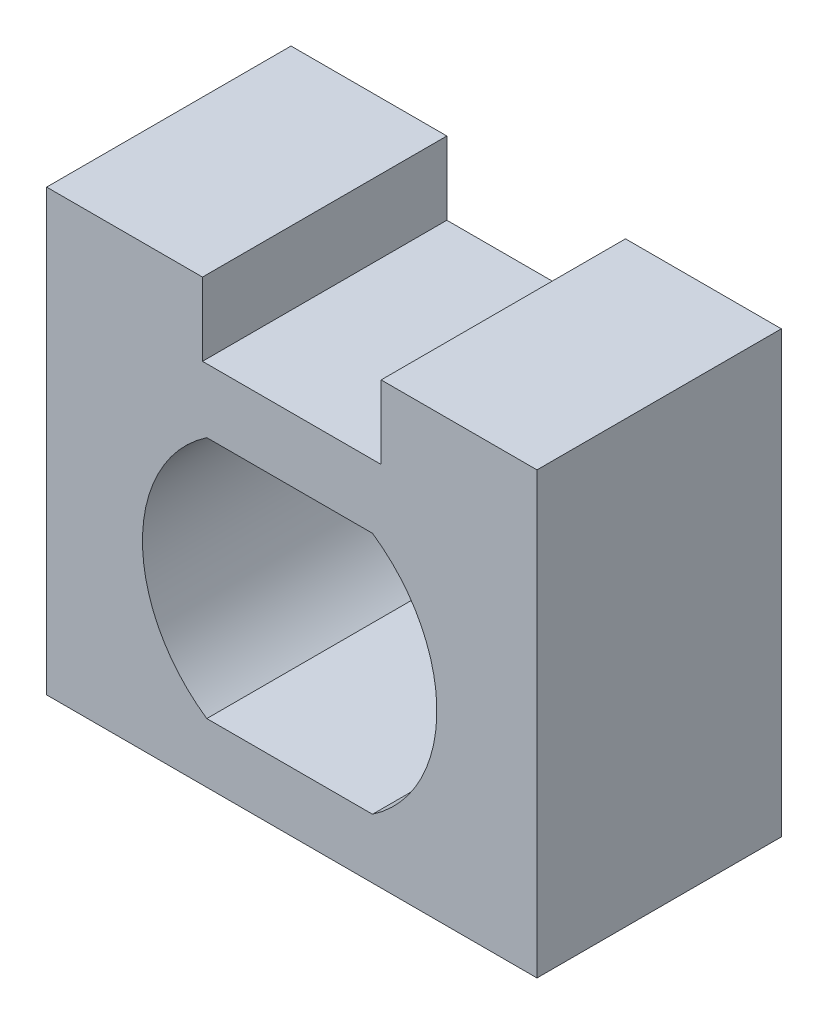
ISO-10303-21;
HEADER;
FILE_DESCRIPTION(('STEP AP214'),'2;1');
FILE_NAME('part.step','',(''),(''),'','','');
FILE_SCHEMA(('AUTOMOTIVE_DESIGN { 1 0 10303 214 1 1 1 1 }'));
ENDSEC;
DATA;
#1=APPLICATION_CONTEXT('core data for automotive mechanical design processes');
#2=APPLICATION_PROTOCOL_DEFINITION('international standard','automotive_design',2000,#1);
#3=PRODUCT_CONTEXT('',#1,'mechanical');
#4=PRODUCT('Part','Part','',(#3));
#5=PRODUCT_RELATED_PRODUCT_CATEGORY('part','',(#4));
#6=PRODUCT_DEFINITION_FORMATION('','',#4);
#7=PRODUCT_DEFINITION_CONTEXT('part definition',#1,'design');
#8=PRODUCT_DEFINITION('design','',#6,#7);
#9=PRODUCT_DEFINITION_SHAPE('','',#8);
#10=(LENGTH_UNIT() NAMED_UNIT(*) SI_UNIT(.MILLI.,.METRE.));
#11=(NAMED_UNIT(*) PLANE_ANGLE_UNIT() SI_UNIT($,.RADIAN.));
#12=(NAMED_UNIT(*) SI_UNIT($,.STERADIAN.) SOLID_ANGLE_UNIT());
#13=UNCERTAINTY_MEASURE_WITH_UNIT(LENGTH_MEASURE(1.E-05),#10,'distance_accuracy_value','');
#14=(GEOMETRIC_REPRESENTATION_CONTEXT(3) GLOBAL_UNCERTAINTY_ASSIGNED_CONTEXT((#13)) GLOBAL_UNIT_ASSIGNED_CONTEXT((#10,
#11,#12)) REPRESENTATION_CONTEXT('',''));
#15=CARTESIAN_POINT('',(0.,0.,0.));
#16=DIRECTION('',(0.,0.,1.));
#17=DIRECTION('',(1.,0.,0.));
#18=AXIS2_PLACEMENT_3D('',#15,#16,#17);
#19=CARTESIAN_POINT('',(20.066,0.,10.));
#20=DIRECTION('',(1.,0.,0.));
#21=DIRECTION('',(0.,0.,-1.));
#22=AXIS2_PLACEMENT_3D('',#19,#20,#21);
#23=PLANE('',#22);
#24=DIRECTION('',(0.,-1.,0.));
#25=VECTOR('',#24,1.);
#26=CARTESIAN_POINT('',(20.066,0.,0.));
#27=LINE('',#26,#25);
#28=CARTESIAN_POINT('',(20.066,18.0086,0.));
#29=VERTEX_POINT('',#28);
#30=CARTESIAN_POINT('',(20.066,0.,0.));
#31=VERTEX_POINT('',#30);
#32=EDGE_CURVE('E171',#29,#31,#27,.T.);
#33=ORIENTED_EDGE('',*,*,#32,.F.);
#34=DIRECTION('',(0.,0.,-1.));
#35=VECTOR('',#34,1.);
#36=CARTESIAN_POINT('',(20.066,18.0086,10.));
#37=LINE('',#36,#35);
#38=CARTESIAN_POINT('',(20.066,18.0086,10.));
#39=VERTEX_POINT('',#38);
#40=EDGE_CURVE('E11',#39,#29,#37,.T.);
#41=ORIENTED_EDGE('',*,*,#40,.F.);
#42=DIRECTION('',(0.,-1.,0.));
#43=VECTOR('',#42,1.);
#44=CARTESIAN_POINT('',(20.066,0.,10.));
#45=LINE('',#44,#43);
#46=CARTESIAN_POINT('',(20.066,0.,10.));
#47=VERTEX_POINT('',#46);
#48=EDGE_CURVE('E226',#39,#47,#45,.T.);
#49=ORIENTED_EDGE('',*,*,#48,.T.);
#50=DIRECTION('',(0.,0.,-1.));
#51=VECTOR('',#50,1.);
#52=CARTESIAN_POINT('',(20.066,0.,10.));
#53=LINE('',#52,#51);
#54=EDGE_CURVE('E99',#47,#31,#53,.T.);
#55=ORIENTED_EDGE('',*,*,#54,.T.);
#56=EDGE_LOOP('',(#33,#41,#49,#55));
#57=FACE_BOUND('',#56,.T.);
#58=ADVANCED_FACE('F34',(#57),#23,.T.);
#59=CARTESIAN_POINT('',(0.,18.0086,10.));
#60=DIRECTION('',(0.,1.,0.));
#61=DIRECTION('',(0.,0.,1.));
#62=AXIS2_PLACEMENT_3D('',#59,#60,#61);
#63=PLANE('',#62);
#64=DIRECTION('',(1.,0.,0.));
#65=VECTOR('',#64,1.);
#66=CARTESIAN_POINT('',(0.,18.0086,0.));
#67=LINE('',#66,#65);
#68=CARTESIAN_POINT('',(13.6884,18.0086,0.));
#69=VERTEX_POINT('',#68);
#70=EDGE_CURVE('E174',#69,#29,#67,.T.);
#71=ORIENTED_EDGE('',*,*,#70,.F.);
#72=DIRECTION('',(0.,0.,-1.));
#73=VECTOR('',#72,1.);
#74=CARTESIAN_POINT('',(13.6884,18.0086,10.));
#75=LINE('',#74,#73);
#76=CARTESIAN_POINT('',(13.6884,18.0086,10.));
#77=VERTEX_POINT('',#76);
#78=EDGE_CURVE('E44',#77,#69,#75,.T.);
#79=ORIENTED_EDGE('',*,*,#78,.F.);
#80=DIRECTION('',(1.,0.,0.));
#81=VECTOR('',#80,1.);
#82=CARTESIAN_POINT('',(0.,18.0086,10.));
#83=LINE('',#82,#81);
#84=EDGE_CURVE('E228',#77,#39,#83,.T.);
#85=ORIENTED_EDGE('',*,*,#84,.T.);
#86=ORIENTED_EDGE('',*,*,#40,.T.);
#87=EDGE_LOOP('',(#71,#79,#85,#86));
#88=FACE_BOUND('',#87,.T.);
#89=ADVANCED_FACE('F248',(#88),#63,.T.);
#90=CARTESIAN_POINT('',(13.6884,0.,10.));
#91=DIRECTION('',(-1.,0.,0.));
#92=DIRECTION('',(0.,0.,1.));
#93=AXIS2_PLACEMENT_3D('',#90,#91,#92);
#94=PLANE('',#93);
#95=DIRECTION('',(0.,1.,0.));
#96=VECTOR('',#95,1.);
#97=CARTESIAN_POINT('',(13.6884,0.,0.));
#98=LINE('',#97,#96);
#99=CARTESIAN_POINT('',(13.6884,15.0114,0.));
#100=VERTEX_POINT('',#99);
#101=EDGE_CURVE('E177',#100,#69,#98,.T.);
#102=ORIENTED_EDGE('',*,*,#101,.F.);
#103=DIRECTION('',(0.,0.,-1.));
#104=VECTOR('',#103,1.);
#105=CARTESIAN_POINT('',(13.6884,15.0114,10.));
#106=LINE('',#105,#104);
#107=CARTESIAN_POINT('',(13.6884,15.0114,10.));
#108=VERTEX_POINT('',#107);
#109=EDGE_CURVE('E197',#108,#100,#106,.T.);
#110=ORIENTED_EDGE('',*,*,#109,.F.);
#111=DIRECTION('',(0.,1.,0.));
#112=VECTOR('',#111,1.);
#113=CARTESIAN_POINT('',(13.6884,0.,10.));
#114=LINE('',#113,#112);
#115=EDGE_CURVE('E234',#108,#77,#114,.T.);
#116=ORIENTED_EDGE('',*,*,#115,.T.);
#117=ORIENTED_EDGE('',*,*,#78,.T.);
#118=EDGE_LOOP('',(#102,#110,#116,#117));
#119=FACE_BOUND('',#118,.T.);
#120=ADVANCED_FACE('F251',(#119),#94,.T.);
#121=CARTESIAN_POINT('',(0.,15.0114,10.));
#122=DIRECTION('',(0.,1.,0.));
#123=DIRECTION('',(-1.,0.,0.));
#124=AXIS2_PLACEMENT_3D('',#121,#122,#123);
#125=PLANE('',#124);
#126=DIRECTION('',(1.,0.,0.));
#127=VECTOR('',#126,1.);
#128=CARTESIAN_POINT('',(0.,15.0114,0.));
#129=LINE('',#128,#127);
#130=CARTESIAN_POINT('',(6.3776,15.0114,0.));
#131=VERTEX_POINT('',#130);
#132=EDGE_CURVE('E180',#131,#100,#129,.T.);
#133=ORIENTED_EDGE('',*,*,#132,.F.);
#134=DIRECTION('',(0.,0.,-1.));
#135=VECTOR('',#134,1.);
#136=CARTESIAN_POINT('',(6.3776,15.0114,10.));
#137=LINE('',#136,#135);
#138=CARTESIAN_POINT('',(6.3776,15.0114,10.));
#139=VERTEX_POINT('',#138);
#140=EDGE_CURVE('E195',#139,#131,#137,.T.);
#141=ORIENTED_EDGE('',*,*,#140,.F.);
#142=DIRECTION('',(1.,0.,0.));
#143=VECTOR('',#142,1.);
#144=CARTESIAN_POINT('',(0.,15.0114,10.));
#145=LINE('',#144,#143);
#146=EDGE_CURVE('E237',#139,#108,#145,.T.);
#147=ORIENTED_EDGE('',*,*,#146,.T.);
#148=ORIENTED_EDGE('',*,*,#109,.T.);
#149=EDGE_LOOP('',(#133,#141,#147,#148));
#150=FACE_BOUND('',#149,.T.);
#151=ADVANCED_FACE('F253',(#150),#125,.T.);
#152=CARTESIAN_POINT('',(6.3776,0.,10.));
#153=DIRECTION('',(1.,0.,0.));
#154=DIRECTION('',(0.,0.,-1.));
#155=AXIS2_PLACEMENT_3D('',#152,#153,#154);
#156=PLANE('',#155);
#157=DIRECTION('',(0.,-1.,0.));
#158=VECTOR('',#157,1.);
#159=CARTESIAN_POINT('',(6.3776,0.,0.));
#160=LINE('',#159,#158);
#161=CARTESIAN_POINT('',(6.3776,17.9980041920549,0.));
#162=VERTEX_POINT('',#161);
#163=EDGE_CURVE('E183',#162,#131,#160,.T.);
#164=ORIENTED_EDGE('',*,*,#163,.F.);
#165=DIRECTION('',(0.,0.,-1.));
#166=VECTOR('',#165,1.);
#167=CARTESIAN_POINT('',(6.3776,17.9980041920549,10.));
#168=LINE('',#167,#166);
#169=CARTESIAN_POINT('',(6.3776,17.9980041920549,10.));
#170=VERTEX_POINT('',#169);
#171=EDGE_CURVE('E144',#170,#162,#168,.T.);
#172=ORIENTED_EDGE('',*,*,#171,.F.);
#173=DIRECTION('',(0.,-1.,0.));
#174=VECTOR('',#173,1.);
#175=CARTESIAN_POINT('',(6.3776,0.,10.));
#176=LINE('',#175,#174);
#177=EDGE_CURVE('E151',#170,#139,#176,.T.);
#178=ORIENTED_EDGE('',*,*,#177,.T.);
#179=ORIENTED_EDGE('',*,*,#140,.T.);
#180=EDGE_LOOP('',(#164,#172,#178,#179));
#181=FACE_BOUND('',#180,.T.);
#182=ADVANCED_FACE('F241',(#181),#156,.T.);
#183=CARTESIAN_POINT('',(0.,17.9980041920549,10.));
#184=DIRECTION('',(0.,1.,0.));
#185=DIRECTION('',(0.,0.,1.));
#186=AXIS2_PLACEMENT_3D('',#183,#184,#185);
#187=PLANE('',#186);
#188=DIRECTION('',(1.,0.,0.));
#189=VECTOR('',#188,1.);
#190=CARTESIAN_POINT('',(0.,17.9980041920549,0.));
#191=LINE('',#190,#189);
#192=CARTESIAN_POINT('',(0.,17.9980041920549,0.));
#193=VERTEX_POINT('',#192);
#194=EDGE_CURVE('E139',#193,#162,#191,.T.);
#195=ORIENTED_EDGE('',*,*,#194,.F.);
#196=DIRECTION('',(0.,0.,-1.));
#197=VECTOR('',#196,1.);
#198=CARTESIAN_POINT('',(0.,17.9980041920549,10.));
#199=LINE('',#198,#197);
#200=CARTESIAN_POINT('',(0.,17.9980041920549,10.));
#201=VERTEX_POINT('',#200);
#202=EDGE_CURVE('E134',#201,#193,#199,.T.);
#203=ORIENTED_EDGE('',*,*,#202,.F.);
#204=DIRECTION('',(1.,0.,0.));
#205=VECTOR('',#204,1.);
#206=CARTESIAN_POINT('',(0.,17.9980041920549,10.));
#207=LINE('',#206,#205);
#208=EDGE_CURVE('E137',#201,#170,#207,.T.);
#209=ORIENTED_EDGE('',*,*,#208,.T.);
#210=ORIENTED_EDGE('',*,*,#171,.T.);
#211=EDGE_LOOP('',(#195,#203,#209,#210));
#212=FACE_BOUND('',#211,.T.);
#213=ADVANCED_FACE('F136',(#212),#187,.T.);
#214=CARTESIAN_POINT('',(0.,0.,10.));
#215=DIRECTION('',(-1.,0.,0.));
#216=DIRECTION('',(0.,-1.,0.));
#217=AXIS2_PLACEMENT_3D('',#214,#215,#216);
#218=PLANE('',#217);
#219=DIRECTION('',(0.,1.,0.));
#220=VECTOR('',#219,1.);
#221=CARTESIAN_POINT('',(0.,0.,0.));
#222=LINE('',#221,#220);
#223=CARTESIAN_POINT('',(0.,0.,0.));
#224=VERTEX_POINT('',#223);
#225=EDGE_CURVE('E187',#224,#193,#222,.T.);
#226=ORIENTED_EDGE('',*,*,#225,.F.);
#227=DIRECTION('',(0.,0.,-1.));
#228=VECTOR('',#227,1.);
#229=CARTESIAN_POINT('',(0.,0.,10.));
#230=LINE('',#229,#228);
#231=CARTESIAN_POINT('',(0.,0.,10.));
#232=VERTEX_POINT('',#231);
#233=EDGE_CURVE('E92',#232,#224,#230,.T.);
#234=ORIENTED_EDGE('',*,*,#233,.F.);
#235=DIRECTION('',(0.,1.,0.));
#236=VECTOR('',#235,1.);
#237=CARTESIAN_POINT('',(0.,0.,10.));
#238=LINE('',#237,#236);
#239=EDGE_CURVE('E148',#232,#201,#238,.T.);
#240=ORIENTED_EDGE('',*,*,#239,.T.);
#241=ORIENTED_EDGE('',*,*,#202,.T.);
#242=EDGE_LOOP('',(#226,#234,#240,#241));
#243=FACE_BOUND('',#242,.T.);
#244=ADVANCED_FACE('F153',(#243),#218,.T.);
#245=CARTESIAN_POINT('',(9.9441,7.4168,10.));
#246=DIRECTION('',(0.,0.,-1.));
#247=DIRECTION('',(-1.,0.,0.));
#248=AXIS2_PLACEMENT_3D('',#245,#246,#247);
#249=CYLINDRICAL_SURFACE('',#248,6.02350972191462);
#250=CARTESIAN_POINT('',(9.9441,7.4168,0.));
#251=DIRECTION('',(0.,0.,1.));
#252=DIRECTION('',(1.,0.,0.));
#253=AXIS2_PLACEMENT_3D('',#250,#251,#252);
#254=CIRCLE('',#253,6.02350972191462);
#255=CARTESIAN_POINT('',(13.335,2.4384,0.));
#256=VERTEX_POINT('',#255);
#257=CARTESIAN_POINT('',(13.335,12.3952,0.));
#258=VERTEX_POINT('',#257);
#259=EDGE_CURVE('E159',#256,#258,#254,.T.);
#260=ORIENTED_EDGE('',*,*,#259,.F.);
#261=DIRECTION('',(0.,0.,-1.));
#262=VECTOR('',#261,1.);
#263=CARTESIAN_POINT('',(13.335,2.4384,10.));
#264=LINE('',#263,#262);
#265=CARTESIAN_POINT('',(13.335,2.4384,10.));
#266=VERTEX_POINT('',#265);
#267=EDGE_CURVE('E38',#266,#256,#264,.T.);
#268=ORIENTED_EDGE('',*,*,#267,.F.);
#269=CARTESIAN_POINT('',(9.9441,7.4168,10.));
#270=DIRECTION('',(0.,0.,1.));
#271=DIRECTION('',(1.,0.,0.));
#272=AXIS2_PLACEMENT_3D('',#269,#270,#271);
#273=CIRCLE('',#272,6.02350972191462);
#274=CARTESIAN_POINT('',(13.335,12.3952,10.));
#275=VERTEX_POINT('',#274);
#276=EDGE_CURVE('E191',#266,#275,#273,.T.);
#277=ORIENTED_EDGE('',*,*,#276,.T.);
#278=DIRECTION('',(0.,0.,-1.));
#279=VECTOR('',#278,1.);
#280=CARTESIAN_POINT('',(13.335,12.3952,10.));
#281=LINE('',#280,#279);
#282=EDGE_CURVE('E155',#275,#258,#281,.T.);
#283=ORIENTED_EDGE('',*,*,#282,.T.);
#284=EDGE_LOOP('',(#260,#268,#277,#283));
#285=FACE_BOUND('',#284,.T.);
#286=ADVANCED_FACE('F36',(#285),#249,.F.);
#287=CARTESIAN_POINT('',(0.,2.4384,10.));
#288=DIRECTION('',(0.,1.,0.));
#289=DIRECTION('',(0.,0.,1.));
#290=AXIS2_PLACEMENT_3D('',#287,#288,#289);
#291=PLANE('',#290);
#292=DIRECTION('',(1.,0.,0.));
#293=VECTOR('',#292,1.);
#294=CARTESIAN_POINT('',(0.,2.4384,0.));
#295=LINE('',#294,#293);
#296=CARTESIAN_POINT('',(6.55320000000003,2.4384,0.));
#297=VERTEX_POINT('',#296);
#298=EDGE_CURVE('E162',#297,#256,#295,.T.);
#299=ORIENTED_EDGE('',*,*,#298,.F.);
#300=DIRECTION('',(0.,0.,-1.));
#301=VECTOR('',#300,1.);
#302=CARTESIAN_POINT('',(6.55320000000003,2.4384,10.));
#303=LINE('',#302,#301);
#304=CARTESIAN_POINT('',(6.55320000000003,2.4384,10.));
#305=VERTEX_POINT('',#304);
#306=EDGE_CURVE('E202',#305,#297,#303,.T.);
#307=ORIENTED_EDGE('',*,*,#306,.F.);
#308=DIRECTION('',(1.,0.,0.));
#309=VECTOR('',#308,1.);
#310=CARTESIAN_POINT('',(0.,2.4384,10.));
#311=LINE('',#310,#309);
#312=EDGE_CURVE('E211',#305,#266,#311,.T.);
#313=ORIENTED_EDGE('',*,*,#312,.T.);
#314=ORIENTED_EDGE('',*,*,#267,.T.);
#315=EDGE_LOOP('',(#299,#307,#313,#314));
#316=FACE_BOUND('',#315,.T.);
#317=ADVANCED_FACE('F209',(#316),#291,.T.);
#318=CARTESIAN_POINT('',(9.9441,7.4168,10.));
#319=DIRECTION('',(0.,0.,-1.));
#320=DIRECTION('',(-1.,0.,0.));
#321=AXIS2_PLACEMENT_3D('',#318,#319,#320);
#322=CYLINDRICAL_SURFACE('',#321,6.02350972191461);
#323=CARTESIAN_POINT('',(9.9441,7.4168,0.));
#324=DIRECTION('',(0.,0.,1.));
#325=DIRECTION('',(1.,0.,0.));
#326=AXIS2_PLACEMENT_3D('',#323,#324,#325);
#327=CIRCLE('',#326,6.02350972191461);
#328=CARTESIAN_POINT('',(6.55319999999999,12.3952,0.));
#329=VERTEX_POINT('',#328);
#330=EDGE_CURVE('E165',#329,#297,#327,.T.);
#331=ORIENTED_EDGE('',*,*,#330,.F.);
#332=DIRECTION('',(0.,0.,-1.));
#333=VECTOR('',#332,1.);
#334=CARTESIAN_POINT('',(6.55319999999999,12.3952,10.));
#335=LINE('',#334,#333);
#336=CARTESIAN_POINT('',(6.55319999999999,12.3952,10.));
#337=VERTEX_POINT('',#336);
#338=EDGE_CURVE('E201',#337,#329,#335,.T.);
#339=ORIENTED_EDGE('',*,*,#338,.F.);
#340=CARTESIAN_POINT('',(9.9441,7.4168,10.));
#341=DIRECTION('',(0.,0.,1.));
#342=DIRECTION('',(1.,0.,0.));
#343=AXIS2_PLACEMENT_3D('',#340,#341,#342);
#344=CIRCLE('',#343,6.02350972191461);
#345=EDGE_CURVE('E218',#337,#305,#344,.T.);
#346=ORIENTED_EDGE('',*,*,#345,.T.);
#347=ORIENTED_EDGE('',*,*,#306,.T.);
#348=EDGE_LOOP('',(#331,#339,#346,#347));
#349=FACE_BOUND('',#348,.T.);
#350=ADVANCED_FACE('F216',(#349),#322,.F.);
#351=CARTESIAN_POINT('',(-1.20482067934508E-13,12.3951999999999,10.));
#352=DIRECTION('',(0.,-1.,0.));
#353=DIRECTION('',(1.,0.,0.));
#354=AXIS2_PLACEMENT_3D('',#351,#352,#353);
#355=PLANE('',#354);
#356=DIRECTION('',(-1.,0.,0.));
#357=VECTOR('',#356,1.);
#358=CARTESIAN_POINT('',(-1.20482067934508E-13,12.3951999999999,0.));
#359=LINE('',#358,#357);
#360=EDGE_CURVE('E168',#258,#329,#359,.T.);
#361=ORIENTED_EDGE('',*,*,#360,.F.);
#362=ORIENTED_EDGE('',*,*,#282,.F.);
#363=DIRECTION('',(-1.,0.,0.));
#364=VECTOR('',#363,1.);
#365=CARTESIAN_POINT('',(-1.20482067934508E-13,12.3951999999999,10.));
#366=LINE('',#365,#364);
#367=EDGE_CURVE('E223',#275,#337,#366,.T.);
#368=ORIENTED_EDGE('',*,*,#367,.T.);
#369=ORIENTED_EDGE('',*,*,#338,.T.);
#370=EDGE_LOOP('',(#361,#362,#368,#369));
#371=FACE_BOUND('',#370,.T.);
#372=ADVANCED_FACE('F225',(#371),#355,.T.);
#373=CARTESIAN_POINT('',(0.,0.,10.));
#374=DIRECTION('',(0.,1.,0.));
#375=DIRECTION('',(0.,0.,1.));
#376=AXIS2_PLACEMENT_3D('',#373,#374,#375);
#377=PLANE('',#376);
#378=DIRECTION('',(1.,0.,0.));
#379=VECTOR('',#378,1.);
#380=CARTESIAN_POINT('',(0.,0.,0.));
#381=LINE('',#380,#379);
#382=EDGE_CURVE('E189',#224,#31,#381,.T.);
#383=ORIENTED_EDGE('',*,*,#382,.T.);
#384=ORIENTED_EDGE('',*,*,#54,.F.);
#385=DIRECTION('',(1.,0.,0.));
#386=VECTOR('',#385,1.);
#387=CARTESIAN_POINT('',(0.,0.,10.));
#388=LINE('',#387,#386);
#389=EDGE_CURVE('E53',#232,#47,#388,.T.);
#390=ORIENTED_EDGE('',*,*,#389,.F.);
#391=ORIENTED_EDGE('',*,*,#233,.T.);
#392=EDGE_LOOP('',(#383,#384,#390,#391));
#393=FACE_BOUND('',#392,.T.);
#394=ADVANCED_FACE('F243',(#393),#377,.F.);
#395=CARTESIAN_POINT('',(0.,0.,10.));
#396=DIRECTION('',(0.,0.,1.));
#397=DIRECTION('',(1.,0.,0.));
#398=AXIS2_PLACEMENT_3D('',#395,#396,#397);
#399=PLANE('',#398);
#400=ORIENTED_EDGE('',*,*,#276,.F.);
#401=ORIENTED_EDGE('',*,*,#312,.F.);
#402=ORIENTED_EDGE('',*,*,#345,.F.);
#403=ORIENTED_EDGE('',*,*,#367,.F.);
#404=EDGE_LOOP('',(#400,#401,#402,#403));
#405=FACE_BOUND('',#404,.T.);
#406=ORIENTED_EDGE('',*,*,#48,.F.);
#407=ORIENTED_EDGE('',*,*,#84,.F.);
#408=ORIENTED_EDGE('',*,*,#115,.F.);
#409=ORIENTED_EDGE('',*,*,#146,.F.);
#410=ORIENTED_EDGE('',*,*,#177,.F.);
#411=ORIENTED_EDGE('',*,*,#208,.F.);
#412=ORIENTED_EDGE('',*,*,#239,.F.);
#413=ORIENTED_EDGE('',*,*,#389,.T.);
#414=EDGE_LOOP('',(#406,#407,#408,#409,#410,#411,#412,#413));
#415=FACE_BOUND('',#414,.T.);
#416=ADVANCED_FACE('F147',(#405,#415),#399,.T.);
#417=CARTESIAN_POINT('',(0.,0.,0.));
#418=DIRECTION('',(0.,0.,1.));
#419=DIRECTION('',(1.,0.,0.));
#420=AXIS2_PLACEMENT_3D('',#417,#418,#419);
#421=PLANE('',#420);
#422=ORIENTED_EDGE('',*,*,#259,.T.);
#423=ORIENTED_EDGE('',*,*,#360,.T.);
#424=ORIENTED_EDGE('',*,*,#330,.T.);
#425=ORIENTED_EDGE('',*,*,#298,.T.);
#426=EDGE_LOOP('',(#422,#423,#424,#425));
#427=FACE_BOUND('',#426,.T.);
#428=ORIENTED_EDGE('',*,*,#32,.T.);
#429=ORIENTED_EDGE('',*,*,#382,.F.);
#430=ORIENTED_EDGE('',*,*,#225,.T.);
#431=ORIENTED_EDGE('',*,*,#194,.T.);
#432=ORIENTED_EDGE('',*,*,#163,.T.);
#433=ORIENTED_EDGE('',*,*,#132,.T.);
#434=ORIENTED_EDGE('',*,*,#101,.T.);
#435=ORIENTED_EDGE('',*,*,#70,.T.);
#436=EDGE_LOOP('',(#428,#429,#430,#431,#432,#433,#434,#435));
#437=FACE_BOUND('',#436,.T.);
#438=ADVANCED_FACE('F214',(#427,#437),#421,.F.);
#439=CLOSED_SHELL('',(#58,#89,#120,#151,#182,#213,#244,#286,#317,#350,#372,#394,#416,#438));
#440=MANIFOLD_SOLID_BREP('B2',#439);
#441=ADVANCED_BREP_SHAPE_REPRESENTATION('',(#18,#440),#14);
#442=SHAPE_DEFINITION_REPRESENTATION(#9,#441);
ENDSEC;
END-ISO-10303-21;
